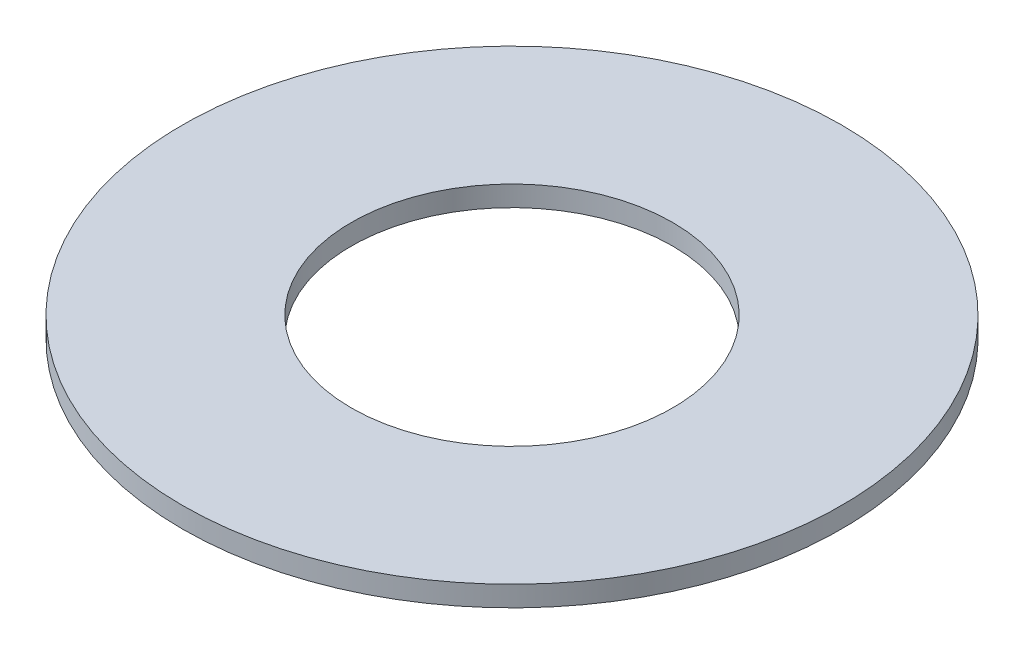
ISO-10303-21;
HEADER;
FILE_DESCRIPTION(('STEP AP214'),'2;1');
FILE_NAME('part.step','',(''),(''),'','','');
FILE_SCHEMA(('AUTOMOTIVE_DESIGN { 1 0 10303 214 1 1 1 1 }'));
ENDSEC;
DATA;
#1=APPLICATION_CONTEXT('core data for automotive mechanical design processes');
#2=APPLICATION_PROTOCOL_DEFINITION('international standard','automotive_design',2000,#1);
#3=PRODUCT_CONTEXT('',#1,'mechanical');
#4=PRODUCT('Part','Part','',(#3));
#5=PRODUCT_RELATED_PRODUCT_CATEGORY('part','',(#4));
#6=PRODUCT_DEFINITION_FORMATION('','',#4);
#7=PRODUCT_DEFINITION_CONTEXT('part definition',#1,'design');
#8=PRODUCT_DEFINITION('design','',#6,#7);
#9=PRODUCT_DEFINITION_SHAPE('','',#8);
#10=(LENGTH_UNIT() NAMED_UNIT(*) SI_UNIT(.MILLI.,.METRE.));
#11=(NAMED_UNIT(*) PLANE_ANGLE_UNIT() SI_UNIT($,.RADIAN.));
#12=(NAMED_UNIT(*) SI_UNIT($,.STERADIAN.) SOLID_ANGLE_UNIT());
#13=UNCERTAINTY_MEASURE_WITH_UNIT(LENGTH_MEASURE(1.E-05),#10,'distance_accuracy_value','');
#14=(GEOMETRIC_REPRESENTATION_CONTEXT(3) GLOBAL_UNCERTAINTY_ASSIGNED_CONTEXT((#13)) GLOBAL_UNIT_ASSIGNED_CONTEXT((#10,
#11,#12)) REPRESENTATION_CONTEXT('',''));
#15=CARTESIAN_POINT('',(0.,0.,0.));
#16=DIRECTION('',(0.,0.,1.));
#17=DIRECTION('',(1.,0.,0.));
#18=AXIS2_PLACEMENT_3D('',#15,#16,#17);
#19=CARTESIAN_POINT('',(0.,2.,0.));
#20=DIRECTION('',(0.,1.,0.));
#21=DIRECTION('',(0.,0.,1.));
#22=AXIS2_PLACEMENT_3D('',#19,#20,#21);
#23=PLANE('',#22);
#24=CARTESIAN_POINT('',(0.,2.,0.));
#25=DIRECTION('',(0.,1.,0.));
#26=DIRECTION('',(0.,0.,1.));
#27=AXIS2_PLACEMENT_3D('',#24,#25,#26);
#28=CIRCLE('',#27,32.2);
#29=CARTESIAN_POINT('',(0.,2.,32.2));
#30=VERTEX_POINT('',#29);
#31=EDGE_CURVE('E10',#30,#30,#28,.T.);
#32=ORIENTED_EDGE('',*,*,#31,.T.);
#33=EDGE_LOOP('',(#32));
#34=FACE_BOUND('',#33,.T.);
#35=CARTESIAN_POINT('',(0.,2.,0.));
#36=DIRECTION('',(0.,1.,0.));
#37=DIRECTION('',(0.,0.,1.));
#38=AXIS2_PLACEMENT_3D('',#35,#36,#37);
#39=CIRCLE('',#38,15.7);
#40=CARTESIAN_POINT('',(0.,2.,15.7));
#41=VERTEX_POINT('',#40);
#42=EDGE_CURVE('E42',#41,#41,#39,.T.);
#43=ORIENTED_EDGE('',*,*,#42,.F.);
#44=EDGE_LOOP('',(#43));
#45=FACE_BOUND('',#44,.T.);
#46=ADVANCED_FACE('F31',(#34,#45),#23,.T.);
#47=CARTESIAN_POINT('',(0.,0.,0.));
#48=DIRECTION('',(0.,1.,0.));
#49=DIRECTION('',(0.,0.,1.));
#50=AXIS2_PLACEMENT_3D('',#47,#48,#49);
#51=PLANE('',#50);
#52=CARTESIAN_POINT('',(0.,0.,0.));
#53=DIRECTION('',(0.,1.,0.));
#54=DIRECTION('',(0.,0.,1.));
#55=AXIS2_PLACEMENT_3D('',#52,#53,#54);
#56=CIRCLE('',#55,32.2);
#57=CARTESIAN_POINT('',(0.,0.,32.2));
#58=VERTEX_POINT('',#57);
#59=EDGE_CURVE('E35',#58,#58,#56,.T.);
#60=ORIENTED_EDGE('',*,*,#59,.F.);
#61=EDGE_LOOP('',(#60));
#62=FACE_BOUND('',#61,.T.);
#63=CARTESIAN_POINT('',(0.,0.,0.));
#64=DIRECTION('',(0.,1.,0.));
#65=DIRECTION('',(0.,0.,1.));
#66=AXIS2_PLACEMENT_3D('',#63,#64,#65);
#67=CIRCLE('',#66,15.7);
#68=CARTESIAN_POINT('',(0.,0.,15.7));
#69=VERTEX_POINT('',#68);
#70=EDGE_CURVE('E44',#69,#69,#67,.T.);
#71=ORIENTED_EDGE('',*,*,#70,.T.);
#72=EDGE_LOOP('',(#71));
#73=FACE_BOUND('',#72,.T.);
#74=ADVANCED_FACE('F54',(#62,#73),#51,.F.);
#75=CARTESIAN_POINT('',(0.,2.,0.));
#76=DIRECTION('',(0.,-1.,0.));
#77=DIRECTION('',(0.,0.,-1.));
#78=AXIS2_PLACEMENT_3D('',#75,#76,#77);
#79=CYLINDRICAL_SURFACE('',#78,32.2);
#80=ORIENTED_EDGE('',*,*,#31,.F.);
#81=EDGE_LOOP('',(#80));
#82=FACE_BOUND('',#81,.T.);
#83=ORIENTED_EDGE('',*,*,#59,.T.);
#84=EDGE_LOOP('',(#83));
#85=FACE_BOUND('',#84,.T.);
#86=ADVANCED_FACE('F33',(#82,#85),#79,.T.);
#87=CARTESIAN_POINT('',(0.,2.,0.));
#88=DIRECTION('',(0.,-1.,0.));
#89=DIRECTION('',(0.,0.,-1.));
#90=AXIS2_PLACEMENT_3D('',#87,#88,#89);
#91=CYLINDRICAL_SURFACE('',#90,15.7);
#92=ORIENTED_EDGE('',*,*,#42,.T.);
#93=EDGE_LOOP('',(#92));
#94=FACE_BOUND('',#93,.T.);
#95=ORIENTED_EDGE('',*,*,#70,.F.);
#96=EDGE_LOOP('',(#95));
#97=FACE_BOUND('',#96,.T.);
#98=ADVANCED_FACE('F50',(#94,#97),#91,.F.);
#99=CLOSED_SHELL('',(#46,#74,#86,#98));
#100=MANIFOLD_SOLID_BREP('B2',#99);
#101=ADVANCED_BREP_SHAPE_REPRESENTATION('',(#18,#100),#14);
#102=SHAPE_DEFINITION_REPRESENTATION(#9,#101);
ENDSEC;
END-ISO-10303-21;
